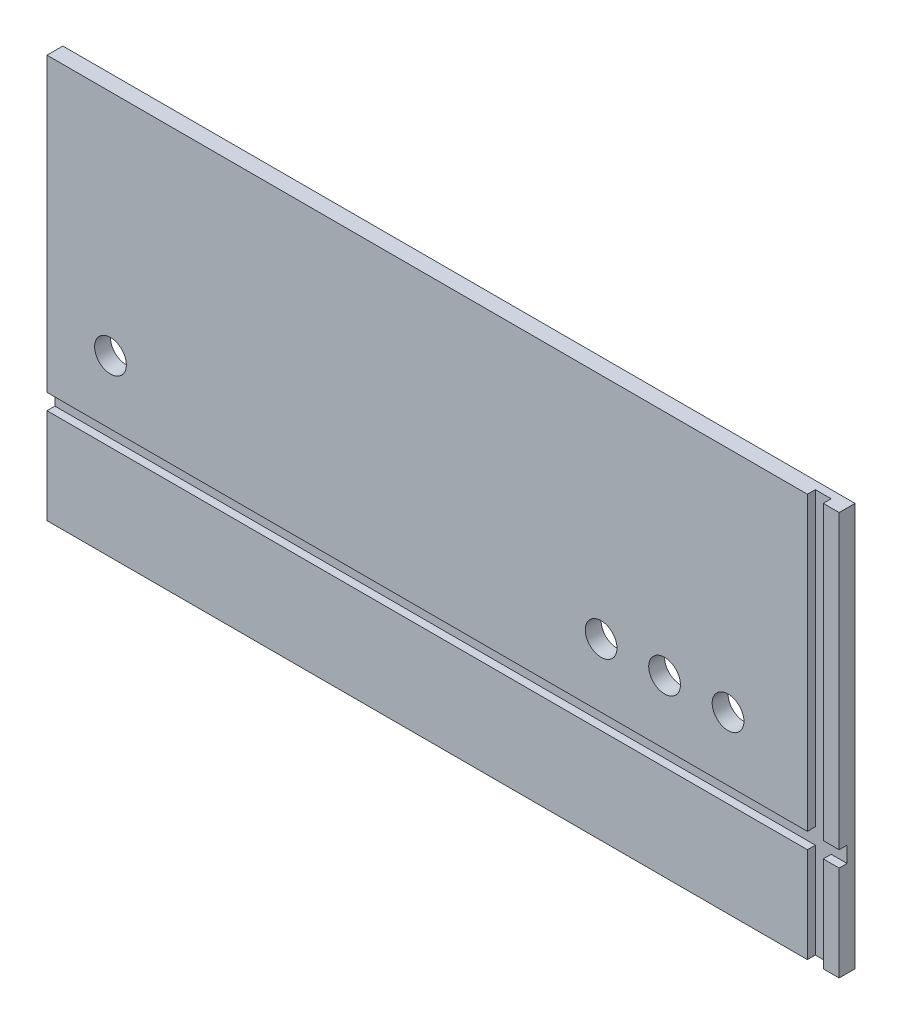
ISO-10303-21;
HEADER;
FILE_DESCRIPTION(('STEP AP214'),'2;1');
FILE_NAME('part.step','',(''),(''),'','','');
FILE_SCHEMA(('AUTOMOTIVE_DESIGN { 1 0 10303 214 1 1 1 1 }'));
ENDSEC;
DATA;
#1=APPLICATION_CONTEXT('core data for automotive mechanical design processes');
#2=APPLICATION_PROTOCOL_DEFINITION('international standard','automotive_design',2000,#1);
#3=PRODUCT_CONTEXT('',#1,'mechanical');
#4=PRODUCT('Part','Part','',(#3));
#5=PRODUCT_RELATED_PRODUCT_CATEGORY('part','',(#4));
#6=PRODUCT_DEFINITION_FORMATION('','',#4);
#7=PRODUCT_DEFINITION_CONTEXT('part definition',#1,'design');
#8=PRODUCT_DEFINITION('design','',#6,#7);
#9=PRODUCT_DEFINITION_SHAPE('','',#8);
#10=(LENGTH_UNIT() NAMED_UNIT(*) SI_UNIT(.MILLI.,.METRE.));
#11=(NAMED_UNIT(*) PLANE_ANGLE_UNIT() SI_UNIT($,.RADIAN.));
#12=(NAMED_UNIT(*) SI_UNIT($,.STERADIAN.) SOLID_ANGLE_UNIT());
#13=UNCERTAINTY_MEASURE_WITH_UNIT(LENGTH_MEASURE(1.E-05),#10,'distance_accuracy_value','');
#14=(GEOMETRIC_REPRESENTATION_CONTEXT(3) GLOBAL_UNCERTAINTY_ASSIGNED_CONTEXT((#13)) GLOBAL_UNIT_ASSIGNED_CONTEXT((#10,
#11,#12)) REPRESENTATION_CONTEXT('',''));
#15=CARTESIAN_POINT('',(0.,0.,0.));
#16=DIRECTION('',(0.,0.,1.));
#17=DIRECTION('',(1.,0.,0.));
#18=AXIS2_PLACEMENT_3D('',#15,#16,#17);
#19=CARTESIAN_POINT('',(0.,0.,3.175));
#20=DIRECTION('',(0.,0.,-1.));
#21=DIRECTION('',(-1.,0.,0.));
#22=AXIS2_PLACEMENT_3D('',#19,#20,#21);
#23=PLANE('',#22);
#24=DIRECTION('',(1.,0.,0.));
#25=VECTOR('',#24,1.);
#26=CARTESIAN_POINT('',(0.,19.05,3.175));
#27=LINE('',#26,#25);
#28=CARTESIAN_POINT('',(155.305,19.05,3.175));
#29=VERTEX_POINT('',#28);
#30=CARTESIAN_POINT('',(158.48,19.05,3.175));
#31=VERTEX_POINT('',#30);
#32=EDGE_CURVE('E249',#29,#31,#27,.T.);
#33=ORIENTED_EDGE('',*,*,#32,.F.);
#34=DIRECTION('',(0.,1.,0.));
#35=VECTOR('',#34,1.);
#36=CARTESIAN_POINT('',(155.305,80.645,3.175));
#37=LINE('',#36,#35);
#38=CARTESIAN_POINT('',(155.305,0.,3.175));
#39=VERTEX_POINT('',#38);
#40=EDGE_CURVE('E162',#39,#29,#37,.T.);
#41=ORIENTED_EDGE('',*,*,#40,.F.);
#42=DIRECTION('',(1.,0.,0.));
#43=VECTOR('',#42,1.);
#44=CARTESIAN_POINT('',(89.265,0.,3.175));
#45=LINE('',#44,#43);
#46=CARTESIAN_POINT('',(158.48,0.,3.175));
#47=VERTEX_POINT('',#46);
#48=EDGE_CURVE('E262',#39,#47,#45,.T.);
#49=ORIENTED_EDGE('',*,*,#48,.T.);
#50=DIRECTION('',(0.,-1.,0.));
#51=VECTOR('',#50,1.);
#52=CARTESIAN_POINT('',(158.48,19.05,3.175));
#53=LINE('',#52,#51);
#54=EDGE_CURVE('E199',#31,#47,#53,.T.);
#55=ORIENTED_EDGE('',*,*,#54,.F.);
#56=EDGE_LOOP('',(#33,#41,#49,#55));
#57=FACE_BOUND('',#56,.T.);
#58=ADVANCED_FACE('F33',(#57),#23,.F.);
#59=DIRECTION('',(-1.,0.,0.));
#60=VECTOR('',#59,1.);
#61=CARTESIAN_POINT('',(0.,80.645,3.175));
#62=LINE('',#61,#60);
#63=CARTESIAN_POINT('',(158.48,80.645,3.175));
#64=VERTEX_POINT('',#63);
#65=CARTESIAN_POINT('',(155.305,80.645,3.175));
#66=VERTEX_POINT('',#65);
#67=EDGE_CURVE('E263',#64,#66,#62,.T.);
#68=ORIENTED_EDGE('',*,*,#67,.T.);
#69=CARTESIAN_POINT('',(155.305,22.225,3.175));
#70=VERTEX_POINT('',#69);
#71=EDGE_CURVE('E296',#70,#66,#37,.T.);
#72=ORIENTED_EDGE('',*,*,#71,.F.);
#73=DIRECTION('',(1.,0.,0.));
#74=VECTOR('',#73,1.);
#75=CARTESIAN_POINT('',(0.,22.225,3.175));
#76=LINE('',#75,#74);
#77=CARTESIAN_POINT('',(158.48,22.225,3.175));
#78=VERTEX_POINT('',#77);
#79=EDGE_CURVE('E253',#70,#78,#76,.T.);
#80=ORIENTED_EDGE('',*,*,#79,.T.);
#81=DIRECTION('',(0.,-1.,0.));
#82=VECTOR('',#81,1.);
#83=CARTESIAN_POINT('',(158.48,80.645,3.175));
#84=LINE('',#83,#82);
#85=EDGE_CURVE('E187',#64,#78,#84,.T.);
#86=ORIENTED_EDGE('',*,*,#85,.F.);
#87=EDGE_LOOP('',(#68,#72,#80,#86));
#88=FACE_BOUND('',#87,.T.);
#89=ADVANCED_FACE('F295',(#88),#23,.F.);
#90=CARTESIAN_POINT('',(0.,19.05,1.5875));
#91=DIRECTION('',(0.,-1.,0.));
#92=DIRECTION('',(0.,0.,-1.));
#93=AXIS2_PLACEMENT_3D('',#90,#91,#92);
#94=PLANE('',#93);
#95=DIRECTION('',(1.,0.,0.));
#96=VECTOR('',#95,1.);
#97=CARTESIAN_POINT('',(0.,19.05,1.5875));
#98=LINE('',#97,#96);
#99=CARTESIAN_POINT('',(155.305,19.05,1.5875));
#100=VERTEX_POINT('',#99);
#101=CARTESIAN_POINT('',(158.48,19.05,1.5875));
#102=VERTEX_POINT('',#101);
#103=EDGE_CURVE('E244',#100,#102,#98,.T.);
#104=ORIENTED_EDGE('',*,*,#103,.F.);
#105=DIRECTION('',(0.,0.,1.));
#106=VECTOR('',#105,1.);
#107=CARTESIAN_POINT('',(155.305,19.05,1.5875));
#108=LINE('',#107,#106);
#109=EDGE_CURVE('E184',#100,#29,#108,.T.);
#110=ORIENTED_EDGE('',*,*,#109,.T.);
#111=ORIENTED_EDGE('',*,*,#32,.T.);
#112=DIRECTION('',(0.,0.,1.));
#113=VECTOR('',#112,1.);
#114=CARTESIAN_POINT('',(158.48,19.05,1.5875));
#115=LINE('',#114,#113);
#116=EDGE_CURVE('E196',#102,#31,#115,.T.);
#117=ORIENTED_EDGE('',*,*,#116,.F.);
#118=EDGE_LOOP('',(#104,#110,#111,#117));
#119=FACE_BOUND('',#118,.T.);
#120=ADVANCED_FACE('F304',(#119),#94,.F.);
#121=CARTESIAN_POINT('',(0.,22.225,3.175));
#122=DIRECTION('',(0.,1.,0.));
#123=DIRECTION('',(0.,0.,1.));
#124=AXIS2_PLACEMENT_3D('',#121,#122,#123);
#125=PLANE('',#124);
#126=ORIENTED_EDGE('',*,*,#79,.F.);
#127=DIRECTION('',(0.,0.,-1.));
#128=VECTOR('',#127,1.);
#129=CARTESIAN_POINT('',(155.305,22.225,3.175));
#130=LINE('',#129,#128);
#131=CARTESIAN_POINT('',(155.305,22.225,1.5875));
#132=VERTEX_POINT('',#131);
#133=EDGE_CURVE('E181',#70,#132,#130,.T.);
#134=ORIENTED_EDGE('',*,*,#133,.T.);
#135=DIRECTION('',(1.,0.,0.));
#136=VECTOR('',#135,1.);
#137=CARTESIAN_POINT('',(0.,22.225,1.5875));
#138=LINE('',#137,#136);
#139=CARTESIAN_POINT('',(158.48,22.225,1.5875));
#140=VERTEX_POINT('',#139);
#141=EDGE_CURVE('E256',#132,#140,#138,.T.);
#142=ORIENTED_EDGE('',*,*,#141,.T.);
#143=DIRECTION('',(0.,0.,-1.));
#144=VECTOR('',#143,1.);
#145=CARTESIAN_POINT('',(158.48,22.225,1.5875));
#146=LINE('',#145,#144);
#147=EDGE_CURVE('E190',#78,#140,#146,.T.);
#148=ORIENTED_EDGE('',*,*,#147,.F.);
#149=EDGE_LOOP('',(#126,#134,#142,#148));
#150=FACE_BOUND('',#149,.T.);
#151=ADVANCED_FACE('F354',(#150),#125,.F.);
#152=CARTESIAN_POINT('',(0.,0.,3.175));
#153=VERTEX_POINT('',#152);
#154=CARTESIAN_POINT('',(152.13,0.,3.175));
#155=VERTEX_POINT('',#154);
#156=EDGE_CURVE('E259',#153,#155,#45,.T.);
#157=ORIENTED_EDGE('',*,*,#156,.T.);
#158=DIRECTION('',(0.,-1.,0.));
#159=VECTOR('',#158,1.);
#160=CARTESIAN_POINT('',(152.13,80.645,3.175));
#161=LINE('',#160,#159);
#162=CARTESIAN_POINT('',(152.13,19.05,3.175));
#163=VERTEX_POINT('',#162);
#164=EDGE_CURVE('E316',#163,#155,#161,.T.);
#165=ORIENTED_EDGE('',*,*,#164,.F.);
#166=CARTESIAN_POINT('',(0.,19.05,3.175));
#167=VERTEX_POINT('',#166);
#168=EDGE_CURVE('E245',#167,#163,#27,.T.);
#169=ORIENTED_EDGE('',*,*,#168,.F.);
#170=DIRECTION('',(0.,-1.,0.));
#171=VECTOR('',#170,1.);
#172=CARTESIAN_POINT('',(0.,0.,3.175));
#173=LINE('',#172,#171);
#174=EDGE_CURVE('E266',#167,#153,#173,.T.);
#175=ORIENTED_EDGE('',*,*,#174,.T.);
#176=EDGE_LOOP('',(#157,#165,#169,#175));
#177=FACE_BOUND('',#176,.T.);
#178=ADVANCED_FACE('F338',(#177),#23,.F.);
#179=CARTESIAN_POINT('',(89.265,0.,3.175));
#180=DIRECTION('',(0.,1.,0.));
#181=DIRECTION('',(0.,0.,1.));
#182=AXIS2_PLACEMENT_3D('',#179,#180,#181);
#183=PLANE('',#182);
#184=ORIENTED_EDGE('',*,*,#48,.F.);
#185=DIRECTION('',(0.,0.,1.));
#186=VECTOR('',#185,1.);
#187=CARTESIAN_POINT('',(155.305,0.,1.5875));
#188=LINE('',#187,#186);
#189=CARTESIAN_POINT('',(155.305,0.,1.5875));
#190=VERTEX_POINT('',#189);
#191=EDGE_CURVE('E171',#190,#39,#188,.T.);
#192=ORIENTED_EDGE('',*,*,#191,.F.);
#193=DIRECTION('',(1.,0.,0.));
#194=VECTOR('',#193,1.);
#195=CARTESIAN_POINT('',(155.305,0.,1.5875));
#196=LINE('',#195,#194);
#197=CARTESIAN_POINT('',(152.13,0.,1.5875));
#198=VERTEX_POINT('',#197);
#199=EDGE_CURVE('E150',#198,#190,#196,.T.);
#200=ORIENTED_EDGE('',*,*,#199,.F.);
#201=DIRECTION('',(0.,0.,1.));
#202=VECTOR('',#201,1.);
#203=CARTESIAN_POINT('',(152.13,0.,1.5875));
#204=LINE('',#203,#202);
#205=EDGE_CURVE('E168',#198,#155,#204,.T.);
#206=ORIENTED_EDGE('',*,*,#205,.T.);
#207=ORIENTED_EDGE('',*,*,#156,.F.);
#208=DIRECTION('',(0.,0.,-1.));
#209=VECTOR('',#208,1.);
#210=CARTESIAN_POINT('',(0.,0.,3.175));
#211=LINE('',#210,#209);
#212=CARTESIAN_POINT('',(0.,0.,0.));
#213=VERTEX_POINT('',#212);
#214=EDGE_CURVE('E41',#153,#213,#211,.T.);
#215=ORIENTED_EDGE('',*,*,#214,.T.);
#216=DIRECTION('',(1.,0.,0.));
#217=VECTOR('',#216,1.);
#218=CARTESIAN_POINT('',(89.265,0.,0.));
#219=LINE('',#218,#217);
#220=CARTESIAN_POINT('',(158.48,0.,0.));
#221=VERTEX_POINT('',#220);
#222=EDGE_CURVE('E248',#213,#221,#219,.T.);
#223=ORIENTED_EDGE('',*,*,#222,.T.);
#224=DIRECTION('',(0.,0.,-1.));
#225=VECTOR('',#224,1.);
#226=CARTESIAN_POINT('',(158.48,0.,3.175));
#227=LINE('',#226,#225);
#228=EDGE_CURVE('E202',#47,#221,#227,.T.);
#229=ORIENTED_EDGE('',*,*,#228,.F.);
#230=EDGE_LOOP('',(#184,#192,#200,#206,#207,#215,#223,#229));
#231=FACE_BOUND('',#230,.T.);
#232=ADVANCED_FACE('F35',(#231),#183,.F.);
#233=CARTESIAN_POINT('',(0.,80.645,3.175));
#234=DIRECTION('',(0.,-1.,0.));
#235=DIRECTION('',(0.,0.,-1.));
#236=AXIS2_PLACEMENT_3D('',#233,#234,#235);
#237=PLANE('',#236);
#238=DIRECTION('',(-1.,0.,0.));
#239=VECTOR('',#238,1.);
#240=CARTESIAN_POINT('',(152.13,80.645,1.5875));
#241=LINE('',#240,#239);
#242=CARTESIAN_POINT('',(155.305,80.645,1.5875));
#243=VERTEX_POINT('',#242);
#244=CARTESIAN_POINT('',(152.13,80.645,1.5875));
#245=VERTEX_POINT('',#244);
#246=EDGE_CURVE('E154',#243,#245,#241,.T.);
#247=ORIENTED_EDGE('',*,*,#246,.F.);
#248=DIRECTION('',(0.,0.,1.));
#249=VECTOR('',#248,1.);
#250=CARTESIAN_POINT('',(155.305,80.645,1.5875));
#251=LINE('',#250,#249);
#252=EDGE_CURVE('E178',#243,#66,#251,.T.);
#253=ORIENTED_EDGE('',*,*,#252,.T.);
#254=ORIENTED_EDGE('',*,*,#67,.F.);
#255=DIRECTION('',(0.,0.,1.));
#256=VECTOR('',#255,1.);
#257=CARTESIAN_POINT('',(158.48,80.645,3.175));
#258=LINE('',#257,#256);
#259=CARTESIAN_POINT('',(158.48,80.645,0.));
#260=VERTEX_POINT('',#259);
#261=EDGE_CURVE('E208',#260,#64,#258,.T.);
#262=ORIENTED_EDGE('',*,*,#261,.F.);
#263=DIRECTION('',(-1.,0.,0.));
#264=VECTOR('',#263,1.);
#265=CARTESIAN_POINT('',(0.,80.645,0.));
#266=LINE('',#265,#264);
#267=CARTESIAN_POINT('',(0.,80.645,0.));
#268=VERTEX_POINT('',#267);
#269=EDGE_CURVE('E271',#260,#268,#266,.T.);
#270=ORIENTED_EDGE('',*,*,#269,.T.);
#271=DIRECTION('',(0.,0.,-1.));
#272=VECTOR('',#271,1.);
#273=CARTESIAN_POINT('',(0.,80.645,3.175));
#274=LINE('',#273,#272);
#275=CARTESIAN_POINT('',(0.,80.645,3.175));
#276=VERTEX_POINT('',#275);
#277=EDGE_CURVE('E11',#276,#268,#274,.T.);
#278=ORIENTED_EDGE('',*,*,#277,.F.);
#279=CARTESIAN_POINT('',(152.13,80.645,3.175));
#280=VERTEX_POINT('',#279);
#281=EDGE_CURVE('E167',#280,#276,#62,.T.);
#282=ORIENTED_EDGE('',*,*,#281,.F.);
#283=DIRECTION('',(0.,0.,1.));
#284=VECTOR('',#283,1.);
#285=CARTESIAN_POINT('',(152.13,80.645,1.5875));
#286=LINE('',#285,#284);
#287=EDGE_CURVE('E145',#245,#280,#286,.T.);
#288=ORIENTED_EDGE('',*,*,#287,.F.);
#289=EDGE_LOOP('',(#247,#253,#254,#262,#270,#278,#282,#288));
#290=FACE_BOUND('',#289,.T.);
#291=ADVANCED_FACE('F165',(#290),#237,.F.);
#292=CARTESIAN_POINT('',(0.,0.,3.175));
#293=DIRECTION('',(1.,0.,0.));
#294=DIRECTION('',(0.,0.,-1.));
#295=AXIS2_PLACEMENT_3D('',#292,#293,#294);
#296=PLANE('',#295);
#297=ORIENTED_EDGE('',*,*,#174,.F.);
#298=DIRECTION('',(0.,0.,-1.));
#299=VECTOR('',#298,1.);
#300=CARTESIAN_POINT('',(0.,19.05,1.5875));
#301=LINE('',#300,#299);
#302=CARTESIAN_POINT('',(0.,19.05,1.5875));
#303=VERTEX_POINT('',#302);
#304=EDGE_CURVE('E233',#167,#303,#301,.T.);
#305=ORIENTED_EDGE('',*,*,#304,.T.);
#306=DIRECTION('',(0.,1.,0.));
#307=VECTOR('',#306,1.);
#308=CARTESIAN_POINT('',(0.,22.225,1.5875));
#309=LINE('',#308,#307);
#310=CARTESIAN_POINT('',(0.,22.225,1.5875));
#311=VERTEX_POINT('',#310);
#312=EDGE_CURVE('E238',#303,#311,#309,.T.);
#313=ORIENTED_EDGE('',*,*,#312,.T.);
#314=DIRECTION('',(0.,0.,1.));
#315=VECTOR('',#314,1.);
#316=CARTESIAN_POINT('',(0.,22.225,3.175));
#317=LINE('',#316,#315);
#318=CARTESIAN_POINT('',(0.,22.225,3.175));
#319=VERTEX_POINT('',#318);
#320=EDGE_CURVE('E241',#311,#319,#317,.T.);
#321=ORIENTED_EDGE('',*,*,#320,.T.);
#322=EDGE_CURVE('E267',#276,#319,#173,.T.);
#323=ORIENTED_EDGE('',*,*,#322,.F.);
#324=ORIENTED_EDGE('',*,*,#277,.T.);
#325=DIRECTION('',(0.,-1.,0.));
#326=VECTOR('',#325,1.);
#327=CARTESIAN_POINT('',(0.,0.,0.));
#328=LINE('',#327,#326);
#329=EDGE_CURVE('E273',#268,#213,#328,.T.);
#330=ORIENTED_EDGE('',*,*,#329,.T.);
#331=ORIENTED_EDGE('',*,*,#214,.F.);
#332=EDGE_LOOP('',(#297,#305,#313,#321,#323,#324,#330,#331));
#333=FACE_BOUND('',#332,.T.);
#334=ADVANCED_FACE('F283',(#333),#296,.F.);
#335=CARTESIAN_POINT('',(110.855,34.9249999999998,3.175));
#336=DIRECTION('',(0.,0.,1.));
#337=DIRECTION('',(1.,0.,0.));
#338=AXIS2_PLACEMENT_3D('',#335,#336,#337);
#339=CIRCLE('',#338,3.175);
#340=CARTESIAN_POINT('',(114.03,34.9249999999998,3.175));
#341=VERTEX_POINT('',#340);
#342=EDGE_CURVE('E211',#341,#341,#339,.T.);
#343=ORIENTED_EDGE('',*,*,#342,.F.);
#344=EDGE_LOOP('',(#343));
#345=FACE_BOUND('',#344,.T.);
#346=CARTESIAN_POINT('',(136.255,34.925,3.175));
#347=DIRECTION('',(0.,0.,1.));
#348=DIRECTION('',(1.,0.,0.));
#349=AXIS2_PLACEMENT_3D('',#346,#347,#348);
#350=CIRCLE('',#349,3.175);
#351=CARTESIAN_POINT('',(139.43,34.925,3.175));
#352=VERTEX_POINT('',#351);
#353=EDGE_CURVE('E215',#352,#352,#350,.T.);
#354=ORIENTED_EDGE('',*,*,#353,.F.);
#355=EDGE_LOOP('',(#354));
#356=FACE_BOUND('',#355,.T.);
#357=CARTESIAN_POINT('',(123.555,34.9249999999999,3.175));
#358=DIRECTION('',(0.,0.,1.));
#359=DIRECTION('',(1.,0.,0.));
#360=AXIS2_PLACEMENT_3D('',#357,#358,#359);
#361=CIRCLE('',#360,3.17500000000001);
#362=CARTESIAN_POINT('',(126.73,34.9249999999999,3.175));
#363=VERTEX_POINT('',#362);
#364=EDGE_CURVE('E221',#363,#363,#361,.T.);
#365=ORIENTED_EDGE('',*,*,#364,.F.);
#366=EDGE_LOOP('',(#365));
#367=FACE_BOUND('',#366,.T.);
#368=CARTESIAN_POINT('',(12.7,34.925,3.175));
#369=DIRECTION('',(0.,0.,1.));
#370=DIRECTION('',(1.,0.,0.));
#371=AXIS2_PLACEMENT_3D('',#368,#369,#370);
#372=CIRCLE('',#371,3.175);
#373=CARTESIAN_POINT('',(15.875,34.925,3.175));
#374=VERTEX_POINT('',#373);
#375=EDGE_CURVE('E227',#374,#374,#372,.T.);
#376=ORIENTED_EDGE('',*,*,#375,.F.);
#377=EDGE_LOOP('',(#376));
#378=FACE_BOUND('',#377,.T.);
#379=CARTESIAN_POINT('',(152.13,22.225,3.175));
#380=VERTEX_POINT('',#379);
#381=EDGE_CURVE('E250',#319,#380,#76,.T.);
#382=ORIENTED_EDGE('',*,*,#381,.T.);
#383=EDGE_CURVE('E315',#280,#380,#161,.T.);
#384=ORIENTED_EDGE('',*,*,#383,.F.);
#385=ORIENTED_EDGE('',*,*,#281,.T.);
#386=ORIENTED_EDGE('',*,*,#322,.T.);
#387=EDGE_LOOP('',(#382,#384,#385,#386));
#388=FACE_BOUND('',#387,.T.);
#389=ADVANCED_FACE('F333',(#345,#356,#367,#378,#388),#23,.F.);
#390=CARTESIAN_POINT('',(0.,0.,0.));
#391=DIRECTION('',(0.,0.,-1.));
#392=DIRECTION('',(-1.,0.,0.));
#393=AXIS2_PLACEMENT_3D('',#390,#391,#392);
#394=PLANE('',#393);
#395=CARTESIAN_POINT('',(110.855,34.9249999999998,0.));
#396=DIRECTION('',(0.,0.,1.));
#397=DIRECTION('',(1.,0.,0.));
#398=AXIS2_PLACEMENT_3D('',#395,#396,#397);
#399=CIRCLE('',#398,3.175);
#400=CARTESIAN_POINT('',(114.03,34.9249999999998,0.));
#401=VERTEX_POINT('',#400);
#402=EDGE_CURVE('E212',#401,#401,#399,.T.);
#403=ORIENTED_EDGE('',*,*,#402,.T.);
#404=EDGE_LOOP('',(#403));
#405=FACE_BOUND('',#404,.T.);
#406=CARTESIAN_POINT('',(136.255,34.925,0.));
#407=DIRECTION('',(0.,0.,1.));
#408=DIRECTION('',(1.,0.,0.));
#409=AXIS2_PLACEMENT_3D('',#406,#407,#408);
#410=CIRCLE('',#409,3.175);
#411=CARTESIAN_POINT('',(139.43,34.925,0.));
#412=VERTEX_POINT('',#411);
#413=EDGE_CURVE('E218',#412,#412,#410,.T.);
#414=ORIENTED_EDGE('',*,*,#413,.T.);
#415=EDGE_LOOP('',(#414));
#416=FACE_BOUND('',#415,.T.);
#417=CARTESIAN_POINT('',(123.555,34.9249999999999,0.));
#418=DIRECTION('',(0.,0.,1.));
#419=DIRECTION('',(1.,0.,0.));
#420=AXIS2_PLACEMENT_3D('',#417,#418,#419);
#421=CIRCLE('',#420,3.17500000000001);
#422=CARTESIAN_POINT('',(126.73,34.9249999999999,0.));
#423=VERTEX_POINT('',#422);
#424=EDGE_CURVE('E224',#423,#423,#421,.T.);
#425=ORIENTED_EDGE('',*,*,#424,.T.);
#426=EDGE_LOOP('',(#425));
#427=FACE_BOUND('',#426,.T.);
#428=CARTESIAN_POINT('',(12.7,34.925,0.));
#429=DIRECTION('',(0.,0.,1.));
#430=DIRECTION('',(1.,0.,0.));
#431=AXIS2_PLACEMENT_3D('',#428,#429,#430);
#432=CIRCLE('',#431,3.175);
#433=CARTESIAN_POINT('',(15.875,34.925,0.));
#434=VERTEX_POINT('',#433);
#435=EDGE_CURVE('E230',#434,#434,#432,.T.);
#436=ORIENTED_EDGE('',*,*,#435,.T.);
#437=EDGE_LOOP('',(#436));
#438=FACE_BOUND('',#437,.T.);
#439=ORIENTED_EDGE('',*,*,#222,.F.);
#440=ORIENTED_EDGE('',*,*,#329,.F.);
#441=ORIENTED_EDGE('',*,*,#269,.F.);
#442=DIRECTION('',(0.,1.,0.));
#443=VECTOR('',#442,1.);
#444=CARTESIAN_POINT('',(158.48,80.645,0.));
#445=LINE('',#444,#443);
#446=EDGE_CURVE('E205',#221,#260,#445,.T.);
#447=ORIENTED_EDGE('',*,*,#446,.F.);
#448=EDGE_LOOP('',(#439,#440,#441,#447));
#449=FACE_BOUND('',#448,.T.);
#450=ADVANCED_FACE('F287',(#405,#416,#427,#438,#449),#394,.T.);
#451=ORIENTED_EDGE('',*,*,#168,.T.);
#452=DIRECTION('',(0.,0.,-1.));
#453=VECTOR('',#452,1.);
#454=CARTESIAN_POINT('',(152.13,19.05,1.5875));
#455=LINE('',#454,#453);
#456=CARTESIAN_POINT('',(152.13,19.05,1.5875));
#457=VERTEX_POINT('',#456);
#458=EDGE_CURVE('E177',#163,#457,#455,.T.);
#459=ORIENTED_EDGE('',*,*,#458,.T.);
#460=EDGE_CURVE('E257',#303,#457,#98,.T.);
#461=ORIENTED_EDGE('',*,*,#460,.F.);
#462=ORIENTED_EDGE('',*,*,#304,.F.);
#463=EDGE_LOOP('',(#451,#459,#461,#462));
#464=FACE_BOUND('',#463,.T.);
#465=ADVANCED_FACE('F347',(#464),#94,.F.);
#466=CARTESIAN_POINT('',(152.13,22.225,1.5875));
#467=VERTEX_POINT('',#466);
#468=EDGE_CURVE('E254',#311,#467,#138,.T.);
#469=ORIENTED_EDGE('',*,*,#468,.T.);
#470=DIRECTION('',(0.,0.,1.));
#471=VECTOR('',#470,1.);
#472=CARTESIAN_POINT('',(152.13,22.225,3.175));
#473=LINE('',#472,#471);
#474=EDGE_CURVE('E148',#467,#380,#473,.T.);
#475=ORIENTED_EDGE('',*,*,#474,.T.);
#476=ORIENTED_EDGE('',*,*,#381,.F.);
#477=ORIENTED_EDGE('',*,*,#320,.F.);
#478=EDGE_LOOP('',(#469,#475,#476,#477));
#479=FACE_BOUND('',#478,.T.);
#480=ADVANCED_FACE('F361',(#479),#125,.F.);
#481=CARTESIAN_POINT('',(0.,22.225,1.5875));
#482=DIRECTION('',(0.,0.,-1.));
#483=DIRECTION('',(-1.,0.,0.));
#484=AXIS2_PLACEMENT_3D('',#481,#482,#483);
#485=PLANE('',#484);
#486=ORIENTED_EDGE('',*,*,#460,.T.);
#487=DIRECTION('',(0.,-1.,0.));
#488=VECTOR('',#487,1.);
#489=CARTESIAN_POINT('',(152.13,80.645,1.5875));
#490=LINE('',#489,#488);
#491=EDGE_CURVE('E151',#457,#198,#490,.T.);
#492=ORIENTED_EDGE('',*,*,#491,.T.);
#493=ORIENTED_EDGE('',*,*,#199,.T.);
#494=DIRECTION('',(0.,1.,0.));
#495=VECTOR('',#494,1.);
#496=CARTESIAN_POINT('',(155.305,80.645,1.5875));
#497=LINE('',#496,#495);
#498=EDGE_CURVE('E55',#190,#100,#497,.T.);
#499=ORIENTED_EDGE('',*,*,#498,.T.);
#500=ORIENTED_EDGE('',*,*,#103,.T.);
#501=DIRECTION('',(0.,-1.,0.));
#502=VECTOR('',#501,1.);
#503=CARTESIAN_POINT('',(158.48,22.225,1.5875));
#504=LINE('',#503,#502);
#505=EDGE_CURVE('E193',#140,#102,#504,.T.);
#506=ORIENTED_EDGE('',*,*,#505,.F.);
#507=ORIENTED_EDGE('',*,*,#141,.F.);
#508=EDGE_CURVE('E158',#132,#243,#497,.T.);
#509=ORIENTED_EDGE('',*,*,#508,.T.);
#510=ORIENTED_EDGE('',*,*,#246,.T.);
#511=EDGE_CURVE('E48',#245,#467,#490,.T.);
#512=ORIENTED_EDGE('',*,*,#511,.T.);
#513=ORIENTED_EDGE('',*,*,#468,.F.);
#514=ORIENTED_EDGE('',*,*,#312,.F.);
#515=EDGE_LOOP('',(#486,#492,#493,#499,#500,#506,#507,#509,#510,#512,#513,#514));
#516=FACE_BOUND('',#515,.T.);
#517=ADVANCED_FACE('F156',(#516),#485,.F.);
#518=CARTESIAN_POINT('',(12.7,34.925,0.));
#519=DIRECTION('',(0.,0.,1.));
#520=DIRECTION('',(1.,0.,0.));
#521=AXIS2_PLACEMENT_3D('',#518,#519,#520);
#522=CYLINDRICAL_SURFACE('',#521,3.175);
#523=ORIENTED_EDGE('',*,*,#435,.F.);
#524=EDGE_LOOP('',(#523));
#525=FACE_BOUND('',#524,.T.);
#526=ORIENTED_EDGE('',*,*,#375,.T.);
#527=EDGE_LOOP('',(#526));
#528=FACE_BOUND('',#527,.T.);
#529=ADVANCED_FACE('F374',(#525,#528),#522,.F.);
#530=CARTESIAN_POINT('',(123.555,34.9249999999999,0.));
#531=DIRECTION('',(0.,0.,1.));
#532=DIRECTION('',(1.,0.,0.));
#533=AXIS2_PLACEMENT_3D('',#530,#531,#532);
#534=CYLINDRICAL_SURFACE('',#533,3.17500000000001);
#535=ORIENTED_EDGE('',*,*,#424,.F.);
#536=EDGE_LOOP('',(#535));
#537=FACE_BOUND('',#536,.T.);
#538=ORIENTED_EDGE('',*,*,#364,.T.);
#539=EDGE_LOOP('',(#538));
#540=FACE_BOUND('',#539,.T.);
#541=ADVANCED_FACE('F379',(#537,#540),#534,.F.);
#542=CARTESIAN_POINT('',(136.255,34.925,0.));
#543=DIRECTION('',(0.,0.,1.));
#544=DIRECTION('',(1.,0.,0.));
#545=AXIS2_PLACEMENT_3D('',#542,#543,#544);
#546=CYLINDRICAL_SURFACE('',#545,3.175);
#547=ORIENTED_EDGE('',*,*,#413,.F.);
#548=EDGE_LOOP('',(#547));
#549=FACE_BOUND('',#548,.T.);
#550=ORIENTED_EDGE('',*,*,#353,.T.);
#551=EDGE_LOOP('',(#550));
#552=FACE_BOUND('',#551,.T.);
#553=ADVANCED_FACE('F383',(#549,#552),#546,.F.);
#554=CARTESIAN_POINT('',(110.855,34.9249999999998,0.));
#555=DIRECTION('',(0.,0.,1.));
#556=DIRECTION('',(1.,0.,0.));
#557=AXIS2_PLACEMENT_3D('',#554,#555,#556);
#558=CYLINDRICAL_SURFACE('',#557,3.175);
#559=ORIENTED_EDGE('',*,*,#402,.F.);
#560=EDGE_LOOP('',(#559));
#561=FACE_BOUND('',#560,.T.);
#562=ORIENTED_EDGE('',*,*,#342,.T.);
#563=EDGE_LOOP('',(#562));
#564=FACE_BOUND('',#563,.T.);
#565=ADVANCED_FACE('F387',(#561,#564),#558,.F.);
#566=CARTESIAN_POINT('',(158.48,22.225,3.175));
#567=DIRECTION('',(-1.,0.,0.));
#568=DIRECTION('',(0.,0.,1.));
#569=AXIS2_PLACEMENT_3D('',#566,#567,#568);
#570=PLANE('',#569);
#571=ORIENTED_EDGE('',*,*,#85,.T.);
#572=ORIENTED_EDGE('',*,*,#147,.T.);
#573=ORIENTED_EDGE('',*,*,#505,.T.);
#574=ORIENTED_EDGE('',*,*,#116,.T.);
#575=ORIENTED_EDGE('',*,*,#54,.T.);
#576=ORIENTED_EDGE('',*,*,#228,.T.);
#577=ORIENTED_EDGE('',*,*,#446,.T.);
#578=ORIENTED_EDGE('',*,*,#261,.T.);
#579=EDGE_LOOP('',(#571,#572,#573,#574,#575,#576,#577,#578));
#580=FACE_BOUND('',#579,.T.);
#581=ADVANCED_FACE('F291',(#580),#570,.F.);
#582=CARTESIAN_POINT('',(152.13,80.645,1.5875));
#583=DIRECTION('',(-1.,0.,0.));
#584=DIRECTION('',(0.,0.,1.));
#585=AXIS2_PLACEMENT_3D('',#582,#583,#584);
#586=PLANE('',#585);
#587=ORIENTED_EDGE('',*,*,#511,.F.);
#588=ORIENTED_EDGE('',*,*,#287,.T.);
#589=ORIENTED_EDGE('',*,*,#383,.T.);
#590=ORIENTED_EDGE('',*,*,#474,.F.);
#591=EDGE_LOOP('',(#587,#588,#589,#590));
#592=FACE_BOUND('',#591,.T.);
#593=ADVANCED_FACE('F143',(#592),#586,.F.);
#594=CARTESIAN_POINT('',(155.305,80.645,1.5875));
#595=DIRECTION('',(1.,0.,0.));
#596=DIRECTION('',(0.,0.,-1.));
#597=AXIS2_PLACEMENT_3D('',#594,#595,#596);
#598=PLANE('',#597);
#599=ORIENTED_EDGE('',*,*,#71,.T.);
#600=ORIENTED_EDGE('',*,*,#252,.F.);
#601=ORIENTED_EDGE('',*,*,#508,.F.);
#602=ORIENTED_EDGE('',*,*,#133,.F.);
#603=EDGE_LOOP('',(#599,#600,#601,#602));
#604=FACE_BOUND('',#603,.T.);
#605=ADVANCED_FACE('F322',(#604),#598,.F.);
#606=ORIENTED_EDGE('',*,*,#498,.F.);
#607=ORIENTED_EDGE('',*,*,#191,.T.);
#608=ORIENTED_EDGE('',*,*,#40,.T.);
#609=ORIENTED_EDGE('',*,*,#109,.F.);
#610=EDGE_LOOP('',(#606,#607,#608,#609));
#611=FACE_BOUND('',#610,.T.);
#612=ADVANCED_FACE('F319',(#611),#598,.F.);
#613=ORIENTED_EDGE('',*,*,#164,.T.);
#614=ORIENTED_EDGE('',*,*,#205,.F.);
#615=ORIENTED_EDGE('',*,*,#491,.F.);
#616=ORIENTED_EDGE('',*,*,#458,.F.);
#617=EDGE_LOOP('',(#613,#614,#615,#616));
#618=FACE_BOUND('',#617,.T.);
#619=ADVANCED_FACE('F321',(#618),#586,.F.);
#620=CLOSED_SHELL('',(#58,#89,#120,#151,#178,#232,#291,#334,#389,#450,#465,#480,#517,#529,#541,
#553,#565,#581,#593,#605,#612,#619));
#621=MANIFOLD_SOLID_BREP('B2',#620);
#622=ADVANCED_BREP_SHAPE_REPRESENTATION('',(#18,#621),#14);
#623=SHAPE_DEFINITION_REPRESENTATION(#9,#622);
ENDSEC;
END-ISO-10303-21;
